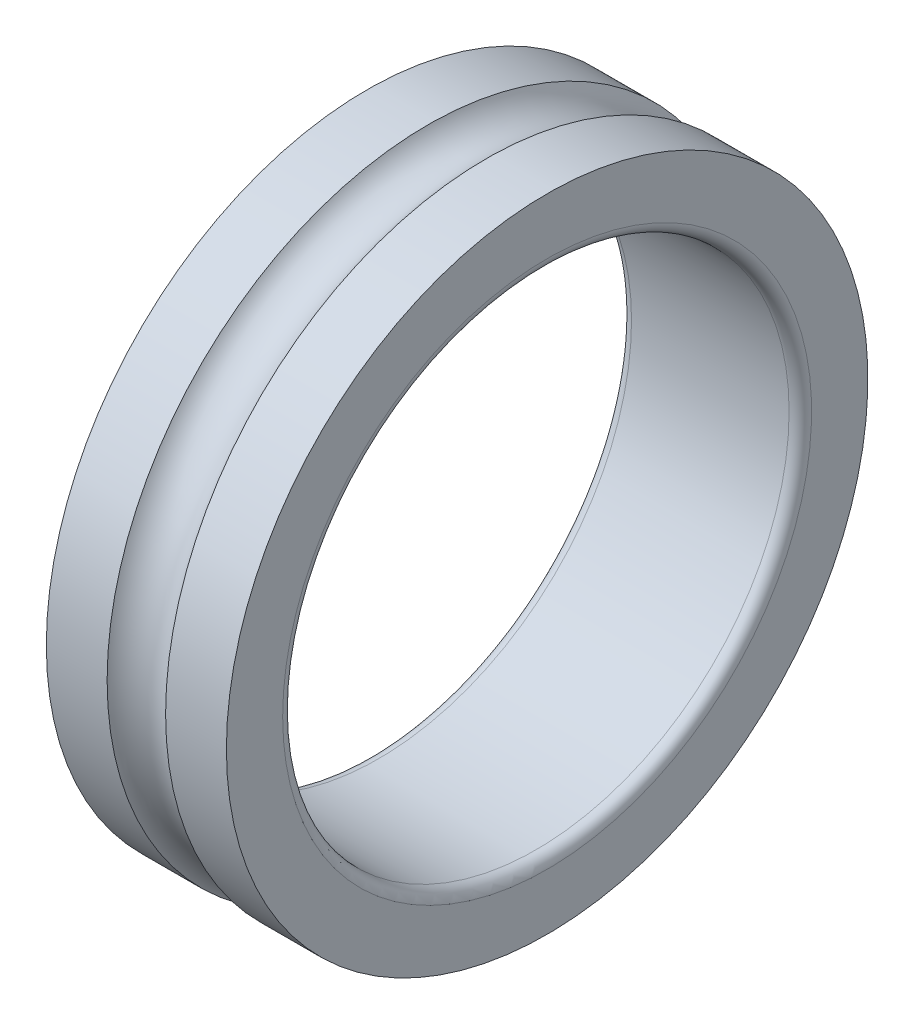
ISO-10303-21;
HEADER;
FILE_DESCRIPTION(('STEP AP214'),'2;1');
FILE_NAME('part.step','',(''),(''),'','','');
FILE_SCHEMA(('AUTOMOTIVE_DESIGN { 1 0 10303 214 1 1 1 1 }'));
ENDSEC;
DATA;
#1=APPLICATION_CONTEXT('core data for automotive mechanical design processes');
#2=APPLICATION_PROTOCOL_DEFINITION('international standard','automotive_design',2000,#1);
#3=PRODUCT_CONTEXT('',#1,'mechanical');
#4=PRODUCT('Part','Part','',(#3));
#5=PRODUCT_RELATED_PRODUCT_CATEGORY('part','',(#4));
#6=PRODUCT_DEFINITION_FORMATION('','',#4);
#7=PRODUCT_DEFINITION_CONTEXT('part definition',#1,'design');
#8=PRODUCT_DEFINITION('design','',#6,#7);
#9=PRODUCT_DEFINITION_SHAPE('','',#8);
#10=(LENGTH_UNIT() NAMED_UNIT(*) SI_UNIT(.MILLI.,.METRE.));
#11=(NAMED_UNIT(*) PLANE_ANGLE_UNIT() SI_UNIT($,.RADIAN.));
#12=(NAMED_UNIT(*) SI_UNIT($,.STERADIAN.) SOLID_ANGLE_UNIT());
#13=UNCERTAINTY_MEASURE_WITH_UNIT(LENGTH_MEASURE(1.E-05),#10,'distance_accuracy_value','');
#14=(GEOMETRIC_REPRESENTATION_CONTEXT(3) GLOBAL_UNCERTAINTY_ASSIGNED_CONTEXT((#13)) GLOBAL_UNIT_ASSIGNED_CONTEXT((#10,
#11,#12)) REPRESENTATION_CONTEXT('',''));
#15=CARTESIAN_POINT('',(0.,0.,0.));
#16=DIRECTION('',(0.,0.,1.));
#17=DIRECTION('',(1.,0.,0.));
#18=AXIS2_PLACEMENT_3D('',#15,#16,#17);
#19=CARTESIAN_POINT('',(0.999999999999226,0.,0.));
#20=DIRECTION('',(-1.,0.,0.));
#21=DIRECTION('',(0.,0.,1.));
#22=AXIS2_PLACEMENT_3D('',#19,#20,#21);
#23=TOROIDAL_SURFACE('',#22,23.4999999999992,0.999999999999225);
#24=CARTESIAN_POINT('',(1.,0.,0.));
#25=DIRECTION('',(-1.,0.,0.));
#26=DIRECTION('',(0.,0.,1.));
#27=AXIS2_PLACEMENT_3D('',#24,#25,#26);
#28=CIRCLE('',#27,22.5);
#29=CARTESIAN_POINT('',(1.,0.,22.5));
#30=VERTEX_POINT('',#29);
#31=EDGE_CURVE('E10',#30,#30,#28,.T.);
#32=ORIENTED_EDGE('',*,*,#31,.F.);
#33=EDGE_LOOP('',(#32));
#34=FACE_BOUND('',#33,.T.);
#35=CARTESIAN_POINT('',(0.,0.,0.));
#36=DIRECTION('',(-1.,0.,0.));
#37=DIRECTION('',(0.,0.,1.));
#38=AXIS2_PLACEMENT_3D('',#35,#36,#37);
#39=CIRCLE('',#38,23.5);
#40=CARTESIAN_POINT('',(0.,0.,23.5));
#41=VERTEX_POINT('',#40);
#42=EDGE_CURVE('E59',#41,#41,#39,.T.);
#43=ORIENTED_EDGE('',*,*,#42,.T.);
#44=EDGE_LOOP('',(#43));
#45=FACE_BOUND('',#44,.T.);
#46=ADVANCED_FACE('F31',(#34,#45),#23,.T.);
#47=CARTESIAN_POINT('',(16.,0.,0.));
#48=DIRECTION('',(-1.,0.,0.));
#49=DIRECTION('',(0.,0.,1.));
#50=AXIS2_PLACEMENT_3D('',#47,#48,#49);
#51=CYLINDRICAL_SURFACE('',#50,22.5);
#52=CARTESIAN_POINT('',(15.,0.,0.));
#53=DIRECTION('',(-1.,0.,0.));
#54=DIRECTION('',(0.,0.,1.));
#55=AXIS2_PLACEMENT_3D('',#52,#53,#54);
#56=CIRCLE('',#55,22.5);
#57=CARTESIAN_POINT('',(15.,0.,22.5));
#58=VERTEX_POINT('',#57);
#59=EDGE_CURVE('E37',#58,#58,#56,.T.);
#60=ORIENTED_EDGE('',*,*,#59,.F.);
#61=EDGE_LOOP('',(#60));
#62=FACE_BOUND('',#61,.T.);
#63=ORIENTED_EDGE('',*,*,#31,.T.);
#64=EDGE_LOOP('',(#63));
#65=FACE_BOUND('',#64,.T.);
#66=ADVANCED_FACE('F96',(#62,#65),#51,.F.);
#67=CARTESIAN_POINT('',(15.0000000000015,0.,0.));
#68=DIRECTION('',(-1.,0.,0.));
#69=DIRECTION('',(0.,0.,1.));
#70=AXIS2_PLACEMENT_3D('',#67,#68,#69);
#71=TOROIDAL_SURFACE('',#70,23.4999999999985,0.99999999999846);
#72=CARTESIAN_POINT('',(16.,0.,0.));
#73=DIRECTION('',(-1.,0.,0.));
#74=DIRECTION('',(0.,0.,1.));
#75=AXIS2_PLACEMENT_3D('',#72,#73,#74);
#76=CIRCLE('',#75,23.5);
#77=CARTESIAN_POINT('',(16.,0.,23.5));
#78=VERTEX_POINT('',#77);
#79=EDGE_CURVE('E41',#78,#78,#76,.T.);
#80=ORIENTED_EDGE('',*,*,#79,.F.);
#81=EDGE_LOOP('',(#80));
#82=FACE_BOUND('',#81,.T.);
#83=ORIENTED_EDGE('',*,*,#59,.T.);
#84=EDGE_LOOP('',(#83));
#85=FACE_BOUND('',#84,.T.);
#86=ADVANCED_FACE('F91',(#82,#85),#71,.T.);
#87=CARTESIAN_POINT('',(16.,23.5,0.));
#88=DIRECTION('',(-1.,0.,0.));
#89=DIRECTION('',(0.,0.,1.));
#90=AXIS2_PLACEMENT_3D('',#87,#88,#89);
#91=PLANE('',#90);
#92=CARTESIAN_POINT('',(16.,0.,0.));
#93=DIRECTION('',(-1.,0.,0.));
#94=DIRECTION('',(0.,0.,1.));
#95=AXIS2_PLACEMENT_3D('',#92,#93,#94);
#96=CIRCLE('',#95,28.5);
#97=CARTESIAN_POINT('',(16.,0.,28.5));
#98=VERTEX_POINT('',#97);
#99=EDGE_CURVE('E45',#98,#98,#96,.T.);
#100=ORIENTED_EDGE('',*,*,#99,.F.);
#101=EDGE_LOOP('',(#100));
#102=FACE_BOUND('',#101,.T.);
#103=ORIENTED_EDGE('',*,*,#79,.T.);
#104=EDGE_LOOP('',(#103));
#105=FACE_BOUND('',#104,.T.);
#106=ADVANCED_FACE('F85',(#102,#105),#91,.F.);
#107=CARTESIAN_POINT('',(16.,0.,0.));
#108=DIRECTION('',(-1.,0.,0.));
#109=DIRECTION('',(0.,0.,1.));
#110=AXIS2_PLACEMENT_3D('',#107,#108,#109);
#111=CYLINDRICAL_SURFACE('',#110,28.5);
#112=CARTESIAN_POINT('',(10.598076211353,0.,0.));
#113=DIRECTION('',(-1.,0.,0.));
#114=DIRECTION('',(0.,0.,1.));
#115=AXIS2_PLACEMENT_3D('',#112,#113,#114);
#116=CIRCLE('',#115,28.5);
#117=CARTESIAN_POINT('',(10.598076211353,0.,28.5));
#118=VERTEX_POINT('',#117);
#119=EDGE_CURVE('E50',#118,#118,#116,.T.);
#120=ORIENTED_EDGE('',*,*,#119,.F.);
#121=EDGE_LOOP('',(#120));
#122=FACE_BOUND('',#121,.T.);
#123=ORIENTED_EDGE('',*,*,#99,.T.);
#124=EDGE_LOOP('',(#123));
#125=FACE_BOUND('',#124,.T.);
#126=ADVANCED_FACE('F79',(#122,#125),#111,.T.);
#127=CARTESIAN_POINT('',(7.99999999999985,0.,0.));
#128=DIRECTION('',(-1.,0.,0.));
#129=DIRECTION('',(0.,0.,1.));
#130=AXIS2_PLACEMENT_3D('',#127,#128,#129);
#131=TOROIDAL_SURFACE('',#130,29.9999999999997,2.99999999999971);
#132=CARTESIAN_POINT('',(5.4019237886467,0.,0.));
#133=DIRECTION('',(-1.,0.,0.));
#134=DIRECTION('',(0.,0.,1.));
#135=AXIS2_PLACEMENT_3D('',#132,#133,#134);
#136=CIRCLE('',#135,28.5);
#137=CARTESIAN_POINT('',(5.4019237886467,0.,28.5));
#138=VERTEX_POINT('',#137);
#139=EDGE_CURVE('E53',#138,#138,#136,.T.);
#140=ORIENTED_EDGE('',*,*,#139,.F.);
#141=EDGE_LOOP('',(#140));
#142=FACE_BOUND('',#141,.T.);
#143=ORIENTED_EDGE('',*,*,#119,.T.);
#144=EDGE_LOOP('',(#143));
#145=FACE_BOUND('',#144,.T.);
#146=ADVANCED_FACE('F73',(#142,#145),#131,.F.);
#147=CARTESIAN_POINT('',(16.,0.,0.));
#148=DIRECTION('',(-1.,0.,0.));
#149=DIRECTION('',(0.,0.,1.));
#150=AXIS2_PLACEMENT_3D('',#147,#148,#149);
#151=CYLINDRICAL_SURFACE('',#150,28.5);
#152=CARTESIAN_POINT('',(0.,0.,0.));
#153=DIRECTION('',(-1.,0.,0.));
#154=DIRECTION('',(0.,0.,1.));
#155=AXIS2_PLACEMENT_3D('',#152,#153,#154);
#156=CIRCLE('',#155,28.5);
#157=CARTESIAN_POINT('',(0.,0.,28.5));
#158=VERTEX_POINT('',#157);
#159=EDGE_CURVE('E56',#158,#158,#156,.T.);
#160=ORIENTED_EDGE('',*,*,#159,.F.);
#161=EDGE_LOOP('',(#160));
#162=FACE_BOUND('',#161,.T.);
#163=ORIENTED_EDGE('',*,*,#139,.T.);
#164=EDGE_LOOP('',(#163));
#165=FACE_BOUND('',#164,.T.);
#166=ADVANCED_FACE('F67',(#162,#165),#151,.T.);
#167=CARTESIAN_POINT('',(0.,28.5,0.));
#168=DIRECTION('',(1.,0.,0.));
#169=DIRECTION('',(0.,0.,-1.));
#170=AXIS2_PLACEMENT_3D('',#167,#168,#169);
#171=PLANE('',#170);
#172=ORIENTED_EDGE('',*,*,#42,.F.);
#173=EDGE_LOOP('',(#172));
#174=FACE_BOUND('',#173,.T.);
#175=ORIENTED_EDGE('',*,*,#159,.T.);
#176=EDGE_LOOP('',(#175));
#177=FACE_BOUND('',#176,.T.);
#178=ADVANCED_FACE('F64',(#174,#177),#171,.F.);
#179=CLOSED_SHELL('',(#46,#66,#86,#106,#126,#146,#166,#178));
#180=MANIFOLD_SOLID_BREP('B2',#179);
#181=ADVANCED_BREP_SHAPE_REPRESENTATION('',(#18,#180),#14);
#182=SHAPE_DEFINITION_REPRESENTATION(#9,#181);
ENDSEC;
END-ISO-10303-21;
